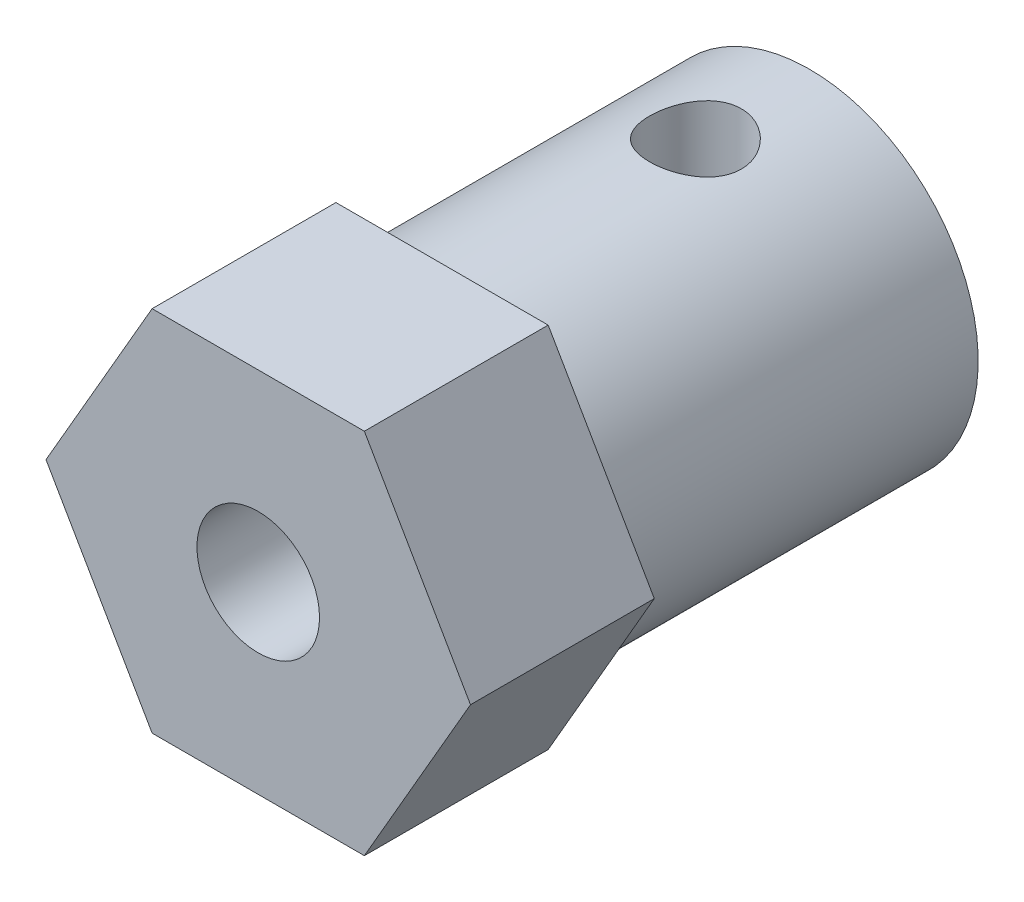
ISO-10303-21;
HEADER;
FILE_DESCRIPTION(('STEP AP214'),'2;1');
FILE_NAME('part.step','',(''),(''),'','','');
FILE_SCHEMA(('AUTOMOTIVE_DESIGN { 1 0 10303 214 1 1 1 1 }'));
ENDSEC;
DATA;
#1=APPLICATION_CONTEXT('core data for automotive mechanical design processes');
#2=APPLICATION_PROTOCOL_DEFINITION('international standard','automotive_design',2000,#1);
#3=PRODUCT_CONTEXT('',#1,'mechanical');
#4=PRODUCT('Part','Part','',(#3));
#5=PRODUCT_RELATED_PRODUCT_CATEGORY('part','',(#4));
#6=PRODUCT_DEFINITION_FORMATION('','',#4);
#7=PRODUCT_DEFINITION_CONTEXT('part definition',#1,'design');
#8=PRODUCT_DEFINITION('design','',#6,#7);
#9=PRODUCT_DEFINITION_SHAPE('','',#8);
#10=(LENGTH_UNIT() NAMED_UNIT(*) SI_UNIT(.MILLI.,.METRE.));
#11=(NAMED_UNIT(*) PLANE_ANGLE_UNIT() SI_UNIT($,.RADIAN.));
#12=(NAMED_UNIT(*) SI_UNIT($,.STERADIAN.) SOLID_ANGLE_UNIT());
#13=UNCERTAINTY_MEASURE_WITH_UNIT(LENGTH_MEASURE(1.E-05),#10,'distance_accuracy_value','');
#14=(GEOMETRIC_REPRESENTATION_CONTEXT(3) GLOBAL_UNCERTAINTY_ASSIGNED_CONTEXT((#13)) GLOBAL_UNIT_ASSIGNED_CONTEXT((#10,
#11,#12)) REPRESENTATION_CONTEXT('',''));
#15=CARTESIAN_POINT('',(0.,0.,0.));
#16=DIRECTION('',(0.,0.,1.));
#17=DIRECTION('',(1.,0.,0.));
#18=AXIS2_PLACEMENT_3D('',#15,#16,#17);
#19=CARTESIAN_POINT('',(0.,0.,0.));
#20=DIRECTION('',(0.,0.,-1.));
#21=DIRECTION('',(-1.,0.,0.));
#22=AXIS2_PLACEMENT_3D('',#19,#20,#21);
#23=PLANE('',#22);
#24=CARTESIAN_POINT('',(0.,0.,0.));
#25=DIRECTION('',(0.,0.,1.));
#26=DIRECTION('',(1.,0.,0.));
#27=AXIS2_PLACEMENT_3D('',#24,#25,#26);
#28=CIRCLE('',#27,2.);
#29=CARTESIAN_POINT('',(2.,0.,0.));
#30=VERTEX_POINT('',#29);
#31=EDGE_CURVE('E215',#30,#30,#28,.T.);
#32=ORIENTED_EDGE('',*,*,#31,.T.);
#33=EDGE_LOOP('',(#32));
#34=FACE_BOUND('',#33,.T.);
#35=CARTESIAN_POINT('',(0.,0.,0.));
#36=DIRECTION('',(0.,0.,-1.));
#37=DIRECTION('',(-1.,0.,0.));
#38=AXIS2_PLACEMENT_3D('',#35,#36,#37);
#39=CIRCLE('',#38,3.);
#40=CARTESIAN_POINT('',(-3.,0.,0.));
#41=VERTEX_POINT('',#40);
#42=EDGE_CURVE('E218',#41,#41,#39,.T.);
#43=ORIENTED_EDGE('',*,*,#42,.T.);
#44=EDGE_LOOP('',(#43));
#45=FACE_BOUND('',#44,.T.);
#46=ADVANCED_FACE('F34',(#34,#45),#23,.T.);
#47=CARTESIAN_POINT('',(0.,0.,6.));
#48=DIRECTION('',(0.,0.,-1.));
#49=DIRECTION('',(-1.,0.,0.));
#50=AXIS2_PLACEMENT_3D('',#47,#48,#49);
#51=PLANE('',#50);
#52=DIRECTION('',(-0.5,-0.866025403784439,0.));
#53=VECTOR('',#52,1.);
#54=CARTESIAN_POINT('',(-6.92820323027551,0.,6.));
#55=LINE('',#54,#53);
#56=CARTESIAN_POINT('',(-3.46410161513775,6.,6.));
#57=VERTEX_POINT('',#56);
#58=CARTESIAN_POINT('',(-6.92820323027551,0.,6.));
#59=VERTEX_POINT('',#58);
#60=EDGE_CURVE('E139',#57,#59,#55,.T.);
#61=ORIENTED_EDGE('',*,*,#60,.T.);
#62=DIRECTION('',(0.5,-0.866025403784439,0.));
#63=VECTOR('',#62,1.);
#64=CARTESIAN_POINT('',(-3.46410161513775,-6.,6.));
#65=LINE('',#64,#63);
#66=CARTESIAN_POINT('',(-3.46410161513775,-6.,6.));
#67=VERTEX_POINT('',#66);
#68=EDGE_CURVE('E96',#59,#67,#65,.T.);
#69=ORIENTED_EDGE('',*,*,#68,.T.);
#70=DIRECTION('',(1.,0.,0.));
#71=VECTOR('',#70,1.);
#72=CARTESIAN_POINT('',(3.46410161513775,-6.,6.));
#73=LINE('',#72,#71);
#74=CARTESIAN_POINT('',(3.46410161513775,-6.,6.));
#75=VERTEX_POINT('',#74);
#76=EDGE_CURVE('E110',#67,#75,#73,.T.);
#77=ORIENTED_EDGE('',*,*,#76,.T.);
#78=DIRECTION('',(0.5,0.866025403784439,0.));
#79=VECTOR('',#78,1.);
#80=CARTESIAN_POINT('',(6.92820323027551,0.,6.));
#81=LINE('',#80,#79);
#82=CARTESIAN_POINT('',(6.92820323027551,0.,6.));
#83=VERTEX_POINT('',#82);
#84=EDGE_CURVE('E103',#75,#83,#81,.T.);
#85=ORIENTED_EDGE('',*,*,#84,.T.);
#86=DIRECTION('',(-0.5,0.866025403784439,0.));
#87=VECTOR('',#86,1.);
#88=CARTESIAN_POINT('',(3.46410161513775,6.,6.));
#89=LINE('',#88,#87);
#90=CARTESIAN_POINT('',(3.46410161513775,6.,6.));
#91=VERTEX_POINT('',#90);
#92=EDGE_CURVE('E108',#83,#91,#89,.T.);
#93=ORIENTED_EDGE('',*,*,#92,.T.);
#94=DIRECTION('',(-1.,0.,0.));
#95=VECTOR('',#94,1.);
#96=CARTESIAN_POINT('',(-3.46410161513775,6.,6.));
#97=LINE('',#96,#95);
#98=EDGE_CURVE('E58',#91,#57,#97,.T.);
#99=ORIENTED_EDGE('',*,*,#98,.T.);
#100=EDGE_LOOP('',(#61,#69,#77,#85,#93,#99));
#101=FACE_BOUND('',#100,.T.);
#102=CARTESIAN_POINT('',(0.,0.,6.));
#103=DIRECTION('',(0.,0.,1.));
#104=DIRECTION('',(1.,0.,0.));
#105=AXIS2_PLACEMENT_3D('',#102,#103,#104);
#106=CIRCLE('',#105,2.);
#107=CARTESIAN_POINT('',(2.,0.,6.));
#108=VERTEX_POINT('',#107);
#109=EDGE_CURVE('E132',#108,#108,#106,.T.);
#110=ORIENTED_EDGE('',*,*,#109,.F.);
#111=EDGE_LOOP('',(#110));
#112=FACE_BOUND('',#111,.T.);
#113=ADVANCED_FACE('F105',(#101,#112),#51,.F.);
#114=CARTESIAN_POINT('',(0.,0.,0.));
#115=DIRECTION('',(0.,0.,-1.));
#116=DIRECTION('',(-1.,0.,0.));
#117=AXIS2_PLACEMENT_3D('',#114,#115,#116);
#118=CIRCLE('',#117,5.5);
#119=CARTESIAN_POINT('',(-5.5,0.,0.));
#120=VERTEX_POINT('',#119);
#121=EDGE_CURVE('E11',#120,#120,#118,.T.);
#122=ORIENTED_EDGE('',*,*,#121,.F.);
#123=EDGE_LOOP('',(#122));
#124=FACE_BOUND('',#123,.T.);
#125=DIRECTION('',(-0.5,-0.866025403784439,0.));
#126=VECTOR('',#125,1.);
#127=CARTESIAN_POINT('',(-6.92820323027551,0.,0.));
#128=LINE('',#127,#126);
#129=CARTESIAN_POINT('',(-3.46410161513775,6.,0.));
#130=VERTEX_POINT('',#129);
#131=CARTESIAN_POINT('',(-6.92820323027551,0.,0.));
#132=VERTEX_POINT('',#131);
#133=EDGE_CURVE('E128',#130,#132,#128,.T.);
#134=ORIENTED_EDGE('',*,*,#133,.F.);
#135=DIRECTION('',(-1.,0.,0.));
#136=VECTOR('',#135,1.);
#137=CARTESIAN_POINT('',(-3.46410161513775,6.,0.));
#138=LINE('',#137,#136);
#139=CARTESIAN_POINT('',(3.46410161513775,6.,0.));
#140=VERTEX_POINT('',#139);
#141=EDGE_CURVE('E87',#140,#130,#138,.T.);
#142=ORIENTED_EDGE('',*,*,#141,.F.);
#143=DIRECTION('',(-0.5,0.866025403784439,0.));
#144=VECTOR('',#143,1.);
#145=CARTESIAN_POINT('',(3.46410161513775,6.,0.));
#146=LINE('',#145,#144);
#147=CARTESIAN_POINT('',(6.92820323027551,0.,0.));
#148=VERTEX_POINT('',#147);
#149=EDGE_CURVE('E81',#148,#140,#146,.T.);
#150=ORIENTED_EDGE('',*,*,#149,.F.);
#151=DIRECTION('',(0.5,0.866025403784439,0.));
#152=VECTOR('',#151,1.);
#153=CARTESIAN_POINT('',(6.92820323027551,0.,0.));
#154=LINE('',#153,#152);
#155=CARTESIAN_POINT('',(3.46410161513775,-6.,0.));
#156=VERTEX_POINT('',#155);
#157=EDGE_CURVE('E118',#156,#148,#154,.T.);
#158=ORIENTED_EDGE('',*,*,#157,.F.);
#159=DIRECTION('',(1.,0.,0.));
#160=VECTOR('',#159,1.);
#161=CARTESIAN_POINT('',(3.46410161513775,-6.,0.));
#162=LINE('',#161,#160);
#163=CARTESIAN_POINT('',(-3.46410161513775,-6.,0.));
#164=VERTEX_POINT('',#163);
#165=EDGE_CURVE('E134',#164,#156,#162,.T.);
#166=ORIENTED_EDGE('',*,*,#165,.F.);
#167=DIRECTION('',(0.5,-0.866025403784439,0.));
#168=VECTOR('',#167,1.);
#169=CARTESIAN_POINT('',(-3.46410161513775,-6.,0.));
#170=LINE('',#169,#168);
#171=EDGE_CURVE('E131',#132,#164,#170,.T.);
#172=ORIENTED_EDGE('',*,*,#171,.F.);
#173=EDGE_LOOP('',(#134,#142,#150,#158,#166,#172));
#174=FACE_BOUND('',#173,.T.);
#175=ADVANCED_FACE('F189',(#124,#174),#23,.T.);
#176=CARTESIAN_POINT('',(-6.92820323027551,0.,6.));
#177=DIRECTION('',(0.866025403784439,-0.5,0.));
#178=DIRECTION('',(0.5,0.866025403784439,0.));
#179=AXIS2_PLACEMENT_3D('',#176,#177,#178);
#180=PLANE('',#179);
#181=ORIENTED_EDGE('',*,*,#133,.T.);
#182=DIRECTION('',(0.,0.,-1.));
#183=VECTOR('',#182,1.);
#184=CARTESIAN_POINT('',(-6.92820323027551,0.,6.));
#185=LINE('',#184,#183);
#186=EDGE_CURVE('E49',#59,#132,#185,.T.);
#187=ORIENTED_EDGE('',*,*,#186,.F.);
#188=ORIENTED_EDGE('',*,*,#60,.F.);
#189=DIRECTION('',(0.,0.,-1.));
#190=VECTOR('',#189,1.);
#191=CARTESIAN_POINT('',(-3.46410161513775,6.,6.));
#192=LINE('',#191,#190);
#193=EDGE_CURVE('E124',#57,#130,#192,.T.);
#194=ORIENTED_EDGE('',*,*,#193,.T.);
#195=EDGE_LOOP('',(#181,#187,#188,#194));
#196=FACE_BOUND('',#195,.T.);
#197=ADVANCED_FACE('F36',(#196),#180,.F.);
#198=CARTESIAN_POINT('',(-3.46410161513775,-6.,6.));
#199=DIRECTION('',(0.866025403784439,0.5,0.));
#200=DIRECTION('',(-0.5,0.866025403784439,0.));
#201=AXIS2_PLACEMENT_3D('',#198,#199,#200);
#202=PLANE('',#201);
#203=ORIENTED_EDGE('',*,*,#171,.T.);
#204=DIRECTION('',(0.,0.,-1.));
#205=VECTOR('',#204,1.);
#206=CARTESIAN_POINT('',(-3.46410161513775,-6.,6.));
#207=LINE('',#206,#205);
#208=EDGE_CURVE('E143',#67,#164,#207,.T.);
#209=ORIENTED_EDGE('',*,*,#208,.F.);
#210=ORIENTED_EDGE('',*,*,#68,.F.);
#211=ORIENTED_EDGE('',*,*,#186,.T.);
#212=EDGE_LOOP('',(#203,#209,#210,#211));
#213=FACE_BOUND('',#212,.T.);
#214=ADVANCED_FACE('F201',(#213),#202,.F.);
#215=CARTESIAN_POINT('',(3.46410161513775,-6.,6.));
#216=DIRECTION('',(0.,1.,0.));
#217=DIRECTION('',(-1.,0.,0.));
#218=AXIS2_PLACEMENT_3D('',#215,#216,#217);
#219=PLANE('',#218);
#220=ORIENTED_EDGE('',*,*,#165,.T.);
#221=DIRECTION('',(0.,0.,-1.));
#222=VECTOR('',#221,1.);
#223=CARTESIAN_POINT('',(3.46410161513775,-6.,6.));
#224=LINE('',#223,#222);
#225=EDGE_CURVE('E119',#75,#156,#224,.T.);
#226=ORIENTED_EDGE('',*,*,#225,.F.);
#227=ORIENTED_EDGE('',*,*,#76,.F.);
#228=ORIENTED_EDGE('',*,*,#208,.T.);
#229=EDGE_LOOP('',(#220,#226,#227,#228));
#230=FACE_BOUND('',#229,.T.);
#231=ADVANCED_FACE('F199',(#230),#219,.F.);
#232=CARTESIAN_POINT('',(6.92820323027551,0.,6.));
#233=DIRECTION('',(-0.866025403784438,0.5,0.));
#234=DIRECTION('',(-0.5,-0.866025403784439,0.));
#235=AXIS2_PLACEMENT_3D('',#232,#233,#234);
#236=PLANE('',#235);
#237=ORIENTED_EDGE('',*,*,#157,.T.);
#238=DIRECTION('',(0.,0.,-1.));
#239=VECTOR('',#238,1.);
#240=CARTESIAN_POINT('',(6.92820323027551,0.,6.));
#241=LINE('',#240,#239);
#242=EDGE_CURVE('E115',#83,#148,#241,.T.);
#243=ORIENTED_EDGE('',*,*,#242,.F.);
#244=ORIENTED_EDGE('',*,*,#84,.F.);
#245=ORIENTED_EDGE('',*,*,#225,.T.);
#246=EDGE_LOOP('',(#237,#243,#244,#245));
#247=FACE_BOUND('',#246,.T.);
#248=ADVANCED_FACE('F116',(#247),#236,.F.);
#249=CARTESIAN_POINT('',(3.46410161513775,6.,6.));
#250=DIRECTION('',(-0.866025403784439,-0.5,0.));
#251=DIRECTION('',(0.5,-0.866025403784439,0.));
#252=AXIS2_PLACEMENT_3D('',#249,#250,#251);
#253=PLANE('',#252);
#254=ORIENTED_EDGE('',*,*,#149,.T.);
#255=DIRECTION('',(0.,0.,-1.));
#256=VECTOR('',#255,1.);
#257=CARTESIAN_POINT('',(3.46410161513775,6.,6.));
#258=LINE('',#257,#256);
#259=EDGE_CURVE('E120',#91,#140,#258,.T.);
#260=ORIENTED_EDGE('',*,*,#259,.F.);
#261=ORIENTED_EDGE('',*,*,#92,.F.);
#262=ORIENTED_EDGE('',*,*,#242,.T.);
#263=EDGE_LOOP('',(#254,#260,#261,#262));
#264=FACE_BOUND('',#263,.T.);
#265=ADVANCED_FACE('F122',(#264),#253,.F.);
#266=CARTESIAN_POINT('',(-3.46410161513775,6.,6.));
#267=DIRECTION('',(0.,-1.,0.));
#268=DIRECTION('',(0.,0.,-1.));
#269=AXIS2_PLACEMENT_3D('',#266,#267,#268);
#270=PLANE('',#269);
#271=ORIENTED_EDGE('',*,*,#141,.T.);
#272=ORIENTED_EDGE('',*,*,#193,.F.);
#273=ORIENTED_EDGE('',*,*,#98,.F.);
#274=ORIENTED_EDGE('',*,*,#259,.T.);
#275=EDGE_LOOP('',(#271,#272,#273,#274));
#276=FACE_BOUND('',#275,.T.);
#277=ADVANCED_FACE('F185',(#276),#270,.F.);
#278=CARTESIAN_POINT('',(0.,0.,6.));
#279=DIRECTION('',(0.,0.,-1.));
#280=DIRECTION('',(-1.,0.,0.));
#281=AXIS2_PLACEMENT_3D('',#278,#279,#280);
#282=CYLINDRICAL_SURFACE('',#281,2.);
#283=ORIENTED_EDGE('',*,*,#109,.T.);
#284=EDGE_LOOP('',(#283));
#285=FACE_BOUND('',#284,.T.);
#286=ORIENTED_EDGE('',*,*,#31,.F.);
#287=EDGE_LOOP('',(#286));
#288=FACE_BOUND('',#287,.T.);
#289=ADVANCED_FACE('F181',(#285,#288),#282,.F.);
#290=CARTESIAN_POINT('',(0.,0.,-12.));
#291=DIRECTION('',(0.,0.,-1.));
#292=DIRECTION('',(-1.,0.,0.));
#293=AXIS2_PLACEMENT_3D('',#290,#291,#292);
#294=PLANE('',#293);
#295=CARTESIAN_POINT('',(0.,0.,-12.));
#296=DIRECTION('',(0.,0.,-1.));
#297=DIRECTION('',(-1.,0.,0.));
#298=AXIS2_PLACEMENT_3D('',#295,#296,#297);
#299=CIRCLE('',#298,5.5);
#300=CARTESIAN_POINT('',(-5.5,0.,-12.));
#301=VERTEX_POINT('',#300);
#302=EDGE_CURVE('E223',#301,#301,#299,.T.);
#303=ORIENTED_EDGE('',*,*,#302,.T.);
#304=EDGE_LOOP('',(#303));
#305=FACE_BOUND('',#304,.T.);
#306=CARTESIAN_POINT('',(0.,0.,-12.));
#307=DIRECTION('',(0.,0.,-1.));
#308=DIRECTION('',(-1.,0.,0.));
#309=AXIS2_PLACEMENT_3D('',#306,#307,#308);
#310=CIRCLE('',#309,3.);
#311=CARTESIAN_POINT('',(-3.,0.,-12.));
#312=VERTEX_POINT('',#311);
#313=EDGE_CURVE('E220',#312,#312,#310,.T.);
#314=ORIENTED_EDGE('',*,*,#313,.F.);
#315=EDGE_LOOP('',(#314));
#316=FACE_BOUND('',#315,.T.);
#317=ADVANCED_FACE('F179',(#305,#316),#294,.T.);
#318=CARTESIAN_POINT('',(0.,0.,-12.));
#319=DIRECTION('',(0.,0.,1.));
#320=DIRECTION('',(1.,0.,0.));
#321=AXIS2_PLACEMENT_3D('',#318,#319,#320);
#322=CYLINDRICAL_SURFACE('',#321,5.5);
#323=CARTESIAN_POINT('',(0.,-5.5,-6.76992574468385));
#324=CARTESIAN_POINT('',(0.0826209133321935,-5.49999882717412,-6.76992755729488));
#325=CARTESIAN_POINT('',(0.165260978812708,-5.49812007260761,-6.77677480826727));
#326=CARTESIAN_POINT('',(0.328155930157698,-5.49080798085451,-6.80393157498703));
#327=CARTESIAN_POINT('',(0.408409727977265,-5.48537304740499,-6.82424713631245));
#328=CARTESIAN_POINT('',(0.564157626055395,-5.47154772174135,-6.87762747642228));
#329=CARTESIAN_POINT('',(0.639657866970163,-5.46316123869395,-6.91067539734577));
#330=CARTESIAN_POINT('',(0.78404449615972,-5.44431654412848,-6.98851867734628));
#331=CARTESIAN_POINT('',(0.852930363289777,-5.43385816956517,-7.03331496103778));
#332=CARTESIAN_POINT('',(0.983796947573261,-5.41171397042059,-7.13452558115111));
#333=CARTESIAN_POINT('',(1.04559512916994,-5.40000641490429,-7.19117118553806));
#334=CARTESIAN_POINT('',(1.15894293682478,-5.37682112935063,-7.31397838071376));
#335=CARTESIAN_POINT('',(1.21049117824721,-5.36534343055203,-7.38014125508617));
#336=CARTESIAN_POINT('',(1.30277794539497,-5.34369384163659,-7.52157699226333));
#337=CARTESIAN_POINT('',(1.34330426837586,-5.33354930058623,-7.59699288962013));
#338=CARTESIAN_POINT('',(1.41102916361227,-5.31603507411917,-7.75388957288323));
#339=CARTESIAN_POINT('',(1.43823031946844,-5.30866485085754,-7.83536917957234));
#340=CARTESIAN_POINT('',(1.47789456441268,-5.2977584719274,-8.00005363969632));
#341=CARTESIAN_POINT('',(1.49068960543229,-5.29413612283787,-8.08317269284577));
#342=CARTESIAN_POINT('',(1.50221364409134,-5.29087829084083,-8.25045042769266));
#343=CARTESIAN_POINT('',(1.50094540140882,-5.2912420257326,-8.33460890218388));
#344=CARTESIAN_POINT('',(1.48464191780301,-5.29583824875456,-8.49896729565012));
#345=CARTESIAN_POINT('',(1.47001073668932,-5.29995718313671,-8.57921097928609));
#346=CARTESIAN_POINT('',(1.42804483871807,-5.3114175579406,-8.73605903070666));
#347=CARTESIAN_POINT('',(1.40070906504647,-5.31875926644153,-8.81266309515015));
#348=CARTESIAN_POINT('',(1.3337862982647,-5.33593618292326,-8.96109926523131));
#349=CARTESIAN_POINT('',(1.29405951882948,-5.34579959764141,-9.03286494571747));
#350=CARTESIAN_POINT('',(1.20357988022174,-5.36689368797792,-9.16885219209351));
#351=CARTESIAN_POINT('',(1.15282476106209,-5.37812464363249,-9.23307220752259));
#352=CARTESIAN_POINT('',(1.03967346682896,-5.40115894990605,-9.35445093449029));
#353=CARTESIAN_POINT('',(0.976938646167251,-5.41296874297114,-9.41129319397279));
#354=CARTESIAN_POINT('',(0.842682011788636,-5.43548647707978,-9.51371670966164));
#355=CARTESIAN_POINT('',(0.771159819718553,-5.44619437064292,-9.55929748073348));
#356=CARTESIAN_POINT('',(0.620853953739623,-5.46537278121261,-9.63805241745878));
#357=CARTESIAN_POINT('',(0.542037637417773,-5.47383251287305,-9.6711670832678));
#358=CARTESIAN_POINT('',(0.37967268871439,-5.48748356142612,-9.723583717198));
#359=CARTESIAN_POINT('',(0.296125144317682,-5.49267562644564,-9.742888847128));
#360=CARTESIAN_POINT('',(0.129368170483251,-5.49909228776313,-9.76663636248083));
#361=CARTESIAN_POINT('',(0.0462242977839802,-5.50043163125371,-9.77150874000422));
#362=CARTESIAN_POINT('',(-0.119693365637972,-5.49932301585136,-9.76744299717042));
#363=CARTESIAN_POINT('',(-0.202467195532507,-5.49687546782998,-9.75850637506736));
#364=CARTESIAN_POINT('',(-0.363745097739556,-5.48854239265957,-9.72742824198071));
#365=CARTESIAN_POINT('',(-0.442299324272677,-5.48271986472129,-9.70552855192685));
#366=CARTESIAN_POINT('',(-0.594609867448631,-5.46829923535645,-9.64942850004336));
#367=CARTESIAN_POINT('',(-0.668365651304996,-5.45970082634473,-9.61522677502257));
#368=CARTESIAN_POINT('',(-0.810641161194591,-5.44041573828275,-9.53470930239817));
#369=CARTESIAN_POINT('',(-0.879024602412584,-5.4296902954988,-9.4881622574223));
#370=CARTESIAN_POINT('',(-1.00716022013082,-5.40738988410034,-9.38456445713861));
#371=CARTESIAN_POINT('',(-1.06691060617763,-5.39581474001048,-9.32751152852634));
#372=CARTESIAN_POINT('',(-1.17791060344313,-5.37269401558495,-9.20251170664897));
#373=CARTESIAN_POINT('',(-1.22885627747222,-5.36115944983886,-9.1342923624049));
#374=CARTESIAN_POINT('',(-1.3185858220796,-5.33980026187814,-8.9900270974646));
#375=CARTESIAN_POINT('',(-1.35737017925923,-5.32997557125461,-8.91398149007633));
#376=CARTESIAN_POINT('',(-1.42138558317209,-5.31326248703816,-8.75658511644189));
#377=CARTESIAN_POINT('',(-1.44669352306985,-5.30635748202252,-8.67526748415863));
#378=CARTESIAN_POINT('',(-1.48320917220692,-5.29626814696188,-8.5093089066563));
#379=CARTESIAN_POINT('',(-1.49442068863148,-5.29308281231875,-8.42466886513019));
#380=CARTESIAN_POINT('',(-1.50219895576908,-5.29088009671763,-8.2575873408664));
#381=CARTESIAN_POINT('',(-1.49925533217026,-5.29172336001588,-8.17517015596136));
#382=CARTESIAN_POINT('',(-1.47994837643976,-5.29715501736986,-8.01205509694888));
#383=CARTESIAN_POINT('',(-1.46358542028567,-5.30174330649891,-7.93135717473681));
#384=CARTESIAN_POINT('',(-1.41819408435119,-5.31406316491799,-7.77461942890773));
#385=CARTESIAN_POINT('',(-1.38927395449127,-5.32176783125817,-7.69854599144209));
#386=CARTESIAN_POINT('',(-1.31967304541385,-5.33945189987964,-7.55227246787052));
#387=CARTESIAN_POINT('',(-1.27899034504456,-5.34943167369227,-7.48207334361868));
#388=CARTESIAN_POINT('',(-1.18555430984851,-5.37092379381814,-7.34721514699121));
#389=CARTESIAN_POINT('',(-1.13246901822125,-5.38247375845259,-7.28279203984074));
#390=CARTESIAN_POINT('',(-1.01636011199274,-5.40559990490855,-7.16360933788925));
#391=CARTESIAN_POINT('',(-0.953334059387993,-5.41717609247304,-7.10885212067852));
#392=CARTESIAN_POINT('',(-0.817407725686078,-5.43936459177359,-7.00933113016445));
#393=CARTESIAN_POINT('',(-0.744315866262519,-5.44994907753807,-6.96482226381688));
#394=CARTESIAN_POINT('',(-0.591399899839279,-5.46865263780403,-6.88879330847238));
#395=CARTESIAN_POINT('',(-0.51157995242122,-5.47677322151197,-6.85726526412953));
#396=CARTESIAN_POINT('',(-0.36010010121821,-5.48864193995757,-6.81198623470486));
#397=CARTESIAN_POINT('',(-0.289064640262467,-5.49286947681091,-6.79625119344215));
#398=CARTESIAN_POINT('',(-0.145357607941484,-5.49854887164354,-6.77522071936503));
#399=CARTESIAN_POINT('',(-0.0726862155649467,-5.5000010318002,-6.76992415002906));
#400=CARTESIAN_POINT('',(0.,-5.5,-6.76992574468385));
#401=B_SPLINE_CURVE_WITH_KNOTS('',3,(#323,#324,#325,#326,#327,#328,#329,#330,#331,#332,#333,
#334,#335,#336,#337,#338,#339,#340,#341,#342,#343,#344,#345,#346,#347,#348,#349,#350,#351,#352,
#353,#354,#355,#356,#357,#358,#359,#360,#361,#362,#363,#364,#365,#366,#367,#368,#369,#370,#371,
#372,#373,#374,#375,#376,#377,#378,#379,#380,#381,#382,#383,#384,#385,#386,#387,#388,#389,#390,
#391,#392,#393,#394,#395,#396,#397,#398,#399,#400),.UNSPECIFIED.,.T.,.F.,(4,2,2,2,2,2,2,2,2,2,2,
2,2,2,2,2,2,2,2,2,2,2,2,2,2,2,2,2,2,2,2,2,2,2,2,2,2,2,4),(0.,0.247596106854897,0.4953034285513,
0.742683902420579,0.990083851364706,1.24285878223179,1.49566783659324,1.75304593650219,
2.01037411390996,2.26164304860926,2.51286267696538,2.75672886674887,3.00061534583717,
3.24735926767928,3.49415380139121,3.74938528550775,4.00462776284424,4.26107349736029,
4.51746049766944,4.76612811343083,5.01476875105251,5.25891111200195,5.50308053475836,
5.75219469009681,6.00136043656003,6.2579007306487,6.51443075867912,6.76948096455404,
7.02446227124211,7.27068852228629,7.51690787489588,7.76104555655817,8.00522313517586,
8.25689011392092,8.50861891104974,8.76605872289059,9.02334052607437,9.2411883209319,
9.45901239561305),.UNSPECIFIED.);
#402=CARTESIAN_POINT('',(0.,-5.5,-6.76992574468385));
#403=VERTEX_POINT('',#402);
#404=EDGE_CURVE('E170',#403,#403,#401,.T.);
#405=ORIENTED_EDGE('',*,*,#404,.T.);
#406=EDGE_LOOP('',(#405));
#407=FACE_BOUND('',#406,.T.);
#408=CARTESIAN_POINT('',(0.,5.5,-6.76992574468385));
#409=CARTESIAN_POINT('',(-0.0826209133321935,5.49999882717412,-6.76992755729488));
#410=CARTESIAN_POINT('',(-0.165260978812708,5.49812007260761,-6.77677480826727));
#411=CARTESIAN_POINT('',(-0.328155930157698,5.49080798085451,-6.80393157498703));
#412=CARTESIAN_POINT('',(-0.408409727977265,5.48537304740499,-6.82424713631245));
#413=CARTESIAN_POINT('',(-0.564157626055395,5.47154772174135,-6.87762747642228));
#414=CARTESIAN_POINT('',(-0.639657866970163,5.46316123869395,-6.91067539734577));
#415=CARTESIAN_POINT('',(-0.78404449615972,5.44431654412848,-6.98851867734628));
#416=CARTESIAN_POINT('',(-0.852930363289777,5.43385816956517,-7.03331496103778));
#417=CARTESIAN_POINT('',(-0.983796947573261,5.41171397042059,-7.13452558115111));
#418=CARTESIAN_POINT('',(-1.04559512916994,5.40000641490429,-7.19117118553806));
#419=CARTESIAN_POINT('',(-1.15894293682478,5.37682112935063,-7.31397838071376));
#420=CARTESIAN_POINT('',(-1.21049117824721,5.36534343055203,-7.38014125508617));
#421=CARTESIAN_POINT('',(-1.30277794539497,5.34369384163659,-7.52157699226333));
#422=CARTESIAN_POINT('',(-1.34330426837586,5.33354930058623,-7.59699288962013));
#423=CARTESIAN_POINT('',(-1.41102916361227,5.31603507411917,-7.75388957288323));
#424=CARTESIAN_POINT('',(-1.43823031946844,5.30866485085754,-7.83536917957234));
#425=CARTESIAN_POINT('',(-1.47789456441268,5.2977584719274,-8.00005363969632));
#426=CARTESIAN_POINT('',(-1.49068960543229,5.29413612283787,-8.08317269284577));
#427=CARTESIAN_POINT('',(-1.50221364409134,5.29087829084083,-8.25045042769266));
#428=CARTESIAN_POINT('',(-1.50094540140882,5.2912420257326,-8.33460890218388));
#429=CARTESIAN_POINT('',(-1.48464191780301,5.29583824875456,-8.49896729565012));
#430=CARTESIAN_POINT('',(-1.47001073668932,5.29995718313671,-8.57921097928609));
#431=CARTESIAN_POINT('',(-1.42804483871807,5.3114175579406,-8.73605903070666));
#432=CARTESIAN_POINT('',(-1.40070906504647,5.31875926644153,-8.81266309515015));
#433=CARTESIAN_POINT('',(-1.3337862982647,5.33593618292326,-8.96109926523131));
#434=CARTESIAN_POINT('',(-1.29405951882948,5.34579959764141,-9.03286494571747));
#435=CARTESIAN_POINT('',(-1.20357988022174,5.36689368797792,-9.16885219209351));
#436=CARTESIAN_POINT('',(-1.15282476106209,5.37812464363249,-9.23307220752259));
#437=CARTESIAN_POINT('',(-1.03967346682896,5.40115894990605,-9.35445093449029));
#438=CARTESIAN_POINT('',(-0.976938646167251,5.41296874297114,-9.41129319397279));
#439=CARTESIAN_POINT('',(-0.842682011788636,5.43548647707978,-9.51371670966164));
#440=CARTESIAN_POINT('',(-0.771159819718553,5.44619437064292,-9.55929748073348));
#441=CARTESIAN_POINT('',(-0.620853953739623,5.46537278121261,-9.63805241745878));
#442=CARTESIAN_POINT('',(-0.542037637417773,5.47383251287305,-9.6711670832678));
#443=CARTESIAN_POINT('',(-0.37967268871439,5.48748356142612,-9.723583717198));
#444=CARTESIAN_POINT('',(-0.296125144317682,5.49267562644564,-9.742888847128));
#445=CARTESIAN_POINT('',(-0.129368170483251,5.49909228776313,-9.76663636248083));
#446=CARTESIAN_POINT('',(-0.0462242977839802,5.50043163125371,-9.77150874000422));
#447=CARTESIAN_POINT('',(0.119693365637972,5.49932301585136,-9.76744299717042));
#448=CARTESIAN_POINT('',(0.202467195532507,5.49687546782998,-9.75850637506736));
#449=CARTESIAN_POINT('',(0.363745097739556,5.48854239265957,-9.72742824198071));
#450=CARTESIAN_POINT('',(0.442299324272677,5.48271986472129,-9.70552855192685));
#451=CARTESIAN_POINT('',(0.594609867448631,5.46829923535645,-9.64942850004336));
#452=CARTESIAN_POINT('',(0.668365651304996,5.45970082634473,-9.61522677502257));
#453=CARTESIAN_POINT('',(0.810641161194591,5.44041573828275,-9.53470930239817));
#454=CARTESIAN_POINT('',(0.879024602412584,5.4296902954988,-9.4881622574223));
#455=CARTESIAN_POINT('',(1.00716022013082,5.40738988410034,-9.38456445713861));
#456=CARTESIAN_POINT('',(1.06691060617763,5.39581474001048,-9.32751152852634));
#457=CARTESIAN_POINT('',(1.17791060344313,5.37269401558495,-9.20251170664897));
#458=CARTESIAN_POINT('',(1.22885627747222,5.36115944983886,-9.1342923624049));
#459=CARTESIAN_POINT('',(1.3185858220796,5.33980026187814,-8.9900270974646));
#460=CARTESIAN_POINT('',(1.35737017925923,5.32997557125461,-8.91398149007633));
#461=CARTESIAN_POINT('',(1.42138558317209,5.31326248703816,-8.75658511644189));
#462=CARTESIAN_POINT('',(1.44669352306985,5.30635748202252,-8.67526748415863));
#463=CARTESIAN_POINT('',(1.48320917220692,5.29626814696188,-8.5093089066563));
#464=CARTESIAN_POINT('',(1.49442068863148,5.29308281231875,-8.42466886513019));
#465=CARTESIAN_POINT('',(1.50219895576908,5.29088009671763,-8.2575873408664));
#466=CARTESIAN_POINT('',(1.49925533217026,5.29172336001588,-8.17517015596136));
#467=CARTESIAN_POINT('',(1.47994837643976,5.29715501736986,-8.01205509694888));
#468=CARTESIAN_POINT('',(1.46358542028567,5.30174330649891,-7.93135717473681));
#469=CARTESIAN_POINT('',(1.41819408435119,5.31406316491799,-7.77461942890773));
#470=CARTESIAN_POINT('',(1.38927395449127,5.32176783125817,-7.69854599144209));
#471=CARTESIAN_POINT('',(1.31967304541385,5.33945189987964,-7.55227246787052));
#472=CARTESIAN_POINT('',(1.27899034504456,5.34943167369227,-7.48207334361868));
#473=CARTESIAN_POINT('',(1.18555430984851,5.37092379381814,-7.34721514699121));
#474=CARTESIAN_POINT('',(1.13246901822125,5.38247375845259,-7.28279203984074));
#475=CARTESIAN_POINT('',(1.01636011199274,5.40559990490855,-7.16360933788925));
#476=CARTESIAN_POINT('',(0.953334059387993,5.41717609247304,-7.10885212067852));
#477=CARTESIAN_POINT('',(0.817407725686078,5.43936459177359,-7.00933113016445));
#478=CARTESIAN_POINT('',(0.744315866262519,5.44994907753807,-6.96482226381688));
#479=CARTESIAN_POINT('',(0.591399899839279,5.46865263780403,-6.88879330847238));
#480=CARTESIAN_POINT('',(0.51157995242122,5.47677322151197,-6.85726526412953));
#481=CARTESIAN_POINT('',(0.36010010121821,5.48864193995757,-6.81198623470486));
#482=CARTESIAN_POINT('',(0.289064640262467,5.49286947681091,-6.79625119344215));
#483=CARTESIAN_POINT('',(0.145357607941484,5.49854887164354,-6.77522071936503));
#484=CARTESIAN_POINT('',(0.0726862155649467,5.5000010318002,-6.76992415002906));
#485=CARTESIAN_POINT('',(0.,5.5,-6.76992574468385));
#486=B_SPLINE_CURVE_WITH_KNOTS('',3,(#408,#409,#410,#411,#412,#413,#414,#415,#416,#417,#418,
#419,#420,#421,#422,#423,#424,#425,#426,#427,#428,#429,#430,#431,#432,#433,#434,#435,#436,#437,
#438,#439,#440,#441,#442,#443,#444,#445,#446,#447,#448,#449,#450,#451,#452,#453,#454,#455,#456,
#457,#458,#459,#460,#461,#462,#463,#464,#465,#466,#467,#468,#469,#470,#471,#472,#473,#474,#475,
#476,#477,#478,#479,#480,#481,#482,#483,#484,#485),.UNSPECIFIED.,.T.,.F.,(4,2,2,2,2,2,2,2,2,2,2,
2,2,2,2,2,2,2,2,2,2,2,2,2,2,2,2,2,2,2,2,2,2,2,2,2,2,2,4),(0.,0.247596106854897,0.4953034285513,
0.742683902420579,0.990083851364706,1.24285878223179,1.49566783659324,1.75304593650219,
2.01037411390996,2.26164304860926,2.51286267696538,2.75672886674887,3.00061534583717,
3.24735926767928,3.49415380139121,3.74938528550775,4.00462776284424,4.26107349736029,
4.51746049766944,4.76612811343083,5.01476875105251,5.25891111200195,5.50308053475836,
5.75219469009681,6.00136043656003,6.2579007306487,6.51443075867912,6.76948096455404,
7.02446227124211,7.27068852228629,7.51690787489588,7.76104555655817,8.00522313517586,
8.25689011392092,8.50861891104974,8.76605872289059,9.02334052607437,9.2411883209319,
9.45901239561305),.UNSPECIFIED.);
#487=CARTESIAN_POINT('',(0.,5.5,-6.76992574468385));
#488=VERTEX_POINT('',#487);
#489=EDGE_CURVE('E164',#488,#488,#486,.T.);
#490=ORIENTED_EDGE('',*,*,#489,.T.);
#491=EDGE_LOOP('',(#490));
#492=FACE_BOUND('',#491,.T.);
#493=ORIENTED_EDGE('',*,*,#302,.F.);
#494=EDGE_LOOP('',(#493));
#495=FACE_BOUND('',#494,.T.);
#496=ORIENTED_EDGE('',*,*,#121,.T.);
#497=EDGE_LOOP('',(#496));
#498=FACE_BOUND('',#497,.T.);
#499=ADVANCED_FACE('F175',(#407,#492,#495,#498),#322,.T.);
#500=CARTESIAN_POINT('',(0.,0.,-12.));
#501=DIRECTION('',(0.,0.,1.));
#502=DIRECTION('',(1.,0.,0.));
#503=AXIS2_PLACEMENT_3D('',#500,#501,#502);
#504=CYLINDRICAL_SURFACE('',#503,3.);
#505=CARTESIAN_POINT('',(0.,-3.,-6.76992574468385));
#506=CARTESIAN_POINT('',(0.0788579444268502,-2.99999570107562,-6.76993069815964));
#507=CARTESIAN_POINT('',(0.157809899546344,-2.99685736529635,-6.77618085436544));
#508=CARTESIAN_POINT('',(0.313380352903344,-2.98461234055736,-6.80090506519616));
#509=CARTESIAN_POINT('',(0.389994130070444,-2.97549431743379,-6.81940233418058));
#510=CARTESIAN_POINT('',(0.538400317320673,-2.95224419105063,-6.8677164576088));
#511=CARTESIAN_POINT('',(0.610210204408719,-2.93813158766306,-6.89748932105581));
#512=CARTESIAN_POINT('',(0.747708925209898,-2.90618664773642,-6.96728167673133));
#513=CARTESIAN_POINT('',(0.813398240985088,-2.88835460450288,-7.00730036105715));
#514=CARTESIAN_POINT('',(0.941261726642864,-2.84934387387093,-7.09920161891178));
#515=CARTESIAN_POINT('',(1.00298281668316,-2.82802798691306,-7.15165546354331));
#516=CARTESIAN_POINT('',(1.11716916730047,-2.78489955370115,-7.26570796355441));
#517=CARTESIAN_POINT('',(1.16962737466015,-2.76308664313552,-7.32731352234252));
#518=CARTESIAN_POINT('',(1.26787800067542,-2.71948426796021,-7.46365076896893));
#519=CARTESIAN_POINT('',(1.31283800332746,-2.69782780455198,-7.53902989220272));
#520=CARTESIAN_POINT('',(1.38925234033604,-2.65928968158481,-7.69747674866318));
#521=CARTESIAN_POINT('',(1.4207163224495,-2.64240461410484,-7.78053893776798));
#522=CARTESIAN_POINT('',(1.46719866328288,-2.61686800556713,-7.94692340281674));
#523=CARTESIAN_POINT('',(1.48308878562066,-2.6077840737557,-8.02993242278494));
#524=CARTESIAN_POINT('',(1.50064048996327,-2.59772834922792,-8.19789400135307));
#525=CARTESIAN_POINT('',(1.50231613255961,-2.59674854014932,-8.28284455599058));
#526=CARTESIAN_POINT('',(1.49203093075844,-2.60266395385873,-8.44135478115691));
#527=CARTESIAN_POINT('',(1.48167683930523,-2.6086314549302,-8.51506179151843));
#528=CARTESIAN_POINT('',(1.4504097735854,-2.62614343100775,-8.65950860874342));
#529=CARTESIAN_POINT('',(1.42949343584648,-2.63768968247664,-8.73024746264183));
#530=CARTESIAN_POINT('',(1.37731467057901,-2.66531214619112,-8.86876944353234));
#531=CARTESIAN_POINT('',(1.34582260067399,-2.68148760995998,-8.93644534286254));
#532=CARTESIAN_POINT('',(1.273562531502,-2.71655106422106,-9.06587718356887));
#533=CARTESIAN_POINT('',(1.2327903657187,-2.73544027170286,-9.12763044808399));
#534=CARTESIAN_POINT('',(1.13709908236918,-2.77669736854929,-9.25170762379869));
#535=CARTESIAN_POINT('',(1.08104168755392,-2.79920265355119,-9.31311105504809));
#536=CARTESIAN_POINT('',(0.959333368112061,-2.84321434950611,-9.42602887257021));
#537=CARTESIAN_POINT('',(0.893677884861428,-2.86472027938201,-9.47753853273468));
#538=CARTESIAN_POINT('',(0.750774758747773,-2.90552980924446,-9.57145423622844));
#539=CARTESIAN_POINT('',(0.673130387399114,-2.92468476243011,-9.61332645335247));
#540=CARTESIAN_POINT('',(0.510699323233195,-2.95736821681863,-9.68307128824837));
#541=CARTESIAN_POINT('',(0.425918364397914,-2.9709011841533,-9.7109550222066));
#542=CARTESIAN_POINT('',(0.259149737491053,-2.98986500612153,-9.74963885025887));
#543=CARTESIAN_POINT('',(0.177512295822489,-2.99587407451965,-9.76166259830403));
#544=CARTESIAN_POINT('',(0.013169399924027,-3.00109520188655,-9.77212284138558));
#545=CARTESIAN_POINT('',(-0.0695355298048636,-3.00031048081978,-9.77056577314306));
#546=CARTESIAN_POINT('',(-0.226849457978981,-2.99236788380152,-9.75461571205574));
#547=CARTESIAN_POINT('',(-0.301589112074895,-2.98570868532252,-9.74122694558886));
#548=CARTESIAN_POINT('',(-0.447610338452912,-2.9673325697226,-9.70356863684117));
#549=CARTESIAN_POINT('',(-0.518891528536631,-2.95561509501618,-9.67929789500361));
#550=CARTESIAN_POINT('',(-0.658332912674359,-2.92776377120382,-9.6199280450343));
#551=CARTESIAN_POINT('',(-0.726345595508705,-2.91151322654446,-9.58453916950942));
#552=CARTESIAN_POINT('',(-0.855692042548907,-2.87615961476126,-9.504264441214));
#553=CARTESIAN_POINT('',(-0.917022944664888,-2.85705533350407,-9.45937454279076));
#554=CARTESIAN_POINT('',(-1.03765153393382,-2.81562332004297,-9.35628510668778));
#555=CARTESIAN_POINT('',(-1.09615811672854,-2.79316327265249,-9.29721144201613));
#556=CARTESIAN_POINT('',(-1.20278448167828,-2.7489358741323,-9.17003801776726));
#557=CARTESIAN_POINT('',(-1.25089707856781,-2.72716901100071,-9.10193206641197));
#558=CARTESIAN_POINT('',(-1.33756187171853,-2.68576788309734,-8.95446026342439));
#559=CARTESIAN_POINT('',(-1.37553824370037,-2.66628794383591,-8.87470884554213));
#560=CARTESIAN_POINT('',(-1.43712423890206,-2.63361108441202,-8.70866064332141));
#561=CARTESIAN_POINT('',(-1.46075237380052,-2.62040607332625,-8.62237245498352));
#562=CARTESIAN_POINT('',(-1.49079253120031,-2.60342251538703,-8.45456041035679));
#563=CARTESIAN_POINT('',(-1.49863949460818,-2.59886075197597,-8.37337436453099));
#564=CARTESIAN_POINT('',(-1.5010337315643,-2.59748031962405,-8.21075514393706));
#565=CARTESIAN_POINT('',(-1.49558676993486,-2.60065829439585,-8.12932209157706));
#566=CARTESIAN_POINT('',(-1.47288918838996,-2.61356793076615,-7.9767004923837));
#567=CARTESIAN_POINT('',(-1.45681247151455,-2.62264641723988,-7.90527503946674));
#568=CARTESIAN_POINT('',(-1.41476303733662,-2.64556524281479,-7.7662135655473));
#569=CARTESIAN_POINT('',(-1.38878713673988,-2.65940711354503,-7.69857877154581));
#570=CARTESIAN_POINT('',(-1.32572361795085,-2.69142795546804,-7.56398846820405));
#571=CARTESIAN_POINT('',(-1.28800670672355,-2.70983583593881,-7.49738389194031));
#572=CARTESIAN_POINT('',(-1.20322645745609,-2.74852997452291,-7.37101394041197));
#573=CARTESIAN_POINT('',(-1.15615825686234,-2.76881720693416,-7.31125214890219));
#574=CARTESIAN_POINT('',(-1.04730498999206,-2.81193484737138,-7.19271277115184));
#575=CARTESIAN_POINT('',(-0.984426634495891,-2.83477474959942,-7.13493709115842));
#576=CARTESIAN_POINT('',(-0.849232209349795,-2.87816628389896,-7.03053126953095));
#577=CARTESIAN_POINT('',(-0.776911084957795,-2.89871667939293,-6.98390713547899));
#578=CARTESIAN_POINT('',(-0.623897395174418,-2.93547014349806,-6.90307120061575));
#579=CARTESIAN_POINT('',(-0.543149255665095,-2.95164144740899,-6.86894949082915));
#580=CARTESIAN_POINT('',(-0.376113151707128,-2.9775201194848,-6.81521349304774));
#581=CARTESIAN_POINT('',(-0.289841699383649,-2.98724585044602,-6.79555797447528));
#582=CARTESIAN_POINT('',(-0.168902919736342,-2.99543192870217,-6.77907962805524));
#583=CARTESIAN_POINT('',(-0.135242819162347,-2.99714048010376,-6.77565178338434));
#584=CARTESIAN_POINT('',(-0.067727597707637,-2.99942545465223,-6.77107374641273));
#585=CARTESIAN_POINT('',(-0.0338724714699425,-3.00000184655071,-6.76992361697854));
#586=CARTESIAN_POINT('',(0.,-3.,-6.76992574468385));
#587=B_SPLINE_CURVE_WITH_KNOTS('',3,(#505,#506,#507,#508,#509,#510,#511,#512,#513,#514,#515,
#516,#517,#518,#519,#520,#521,#522,#523,#524,#525,#526,#527,#528,#529,#530,#531,#532,#533,#534,
#535,#536,#537,#538,#539,#540,#541,#542,#543,#544,#545,#546,#547,#548,#549,#550,#551,#552,#553,
#554,#555,#556,#557,#558,#559,#560,#561,#562,#563,#564,#565,#566,#567,#568,#569,#570,#571,#572,
#573,#574,#575,#576,#577,#578,#579,#580,#581,#582,#583,#584,#585,#586),.UNSPECIFIED.,.T.,.F.,(4,
2,2,2,2,2,2,2,2,2,2,2,2,2,2,2,2,2,2,2,2,2,2,2,2,2,2,2,2,2,2,2,2,2,2,2,2,2,2,2,4),(0.,
0.236436386130439,0.473322224563796,0.709293233238447,0.945245640872351,1.19547263807713,
1.44588935648105,1.71572589646129,1.98536921847421,2.23887018210344,2.49212035993531,
2.71508568613981,2.93812205888518,3.16635360252731,3.39468781890333,3.65197412000818,
3.90938301898029,4.17874533321661,4.44789325368419,4.69474935707018,4.94148846767214,
5.16910359759183,5.39674382446397,5.63089284041848,5.86514176122509,6.12239415966628,
6.37982382923147,6.64972023242588,6.91926767918176,7.1629396125457,7.40650589797017,
7.62686895373283,7.84730293182526,8.0825468517043,8.31791341715446,8.58187864135757,
8.84598575071868,9.1119602049529,9.37717362931724,9.47872920200875,9.58028757766599),.UNSPECIFIED.);
#588=CARTESIAN_POINT('',(0.,-3.,-6.76992574468385));
#589=VERTEX_POINT('',#588);
#590=EDGE_CURVE('E38',#589,#589,#587,.T.);
#591=ORIENTED_EDGE('',*,*,#590,.F.);
#592=EDGE_LOOP('',(#591));
#593=FACE_BOUND('',#592,.T.);
#594=CARTESIAN_POINT('',(0.,3.,-6.76992574468385));
#595=CARTESIAN_POINT('',(-0.0788579444268502,2.99999570107562,-6.76993069815964));
#596=CARTESIAN_POINT('',(-0.157809899546344,2.99685736529635,-6.77618085436544));
#597=CARTESIAN_POINT('',(-0.313380352903344,2.98461234055736,-6.80090506519616));
#598=CARTESIAN_POINT('',(-0.389994130070444,2.97549431743379,-6.81940233418058));
#599=CARTESIAN_POINT('',(-0.538400317320673,2.95224419105063,-6.8677164576088));
#600=CARTESIAN_POINT('',(-0.610210204408719,2.93813158766306,-6.89748932105581));
#601=CARTESIAN_POINT('',(-0.747708925209898,2.90618664773642,-6.96728167673133));
#602=CARTESIAN_POINT('',(-0.813398240985088,2.88835460450288,-7.00730036105715));
#603=CARTESIAN_POINT('',(-0.941261726642864,2.84934387387093,-7.09920161891178));
#604=CARTESIAN_POINT('',(-1.00298281668316,2.82802798691306,-7.15165546354331));
#605=CARTESIAN_POINT('',(-1.11716916730047,2.78489955370115,-7.26570796355441));
#606=CARTESIAN_POINT('',(-1.16962737466015,2.76308664313552,-7.32731352234252));
#607=CARTESIAN_POINT('',(-1.26787800067542,2.71948426796021,-7.46365076896893));
#608=CARTESIAN_POINT('',(-1.31283800332746,2.69782780455198,-7.53902989220272));
#609=CARTESIAN_POINT('',(-1.38925234033604,2.65928968158481,-7.69747674866318));
#610=CARTESIAN_POINT('',(-1.4207163224495,2.64240461410484,-7.78053893776798));
#611=CARTESIAN_POINT('',(-1.46719866328288,2.61686800556713,-7.94692340281674));
#612=CARTESIAN_POINT('',(-1.48308878562066,2.6077840737557,-8.02993242278494));
#613=CARTESIAN_POINT('',(-1.50064048996327,2.59772834922792,-8.19789400135307));
#614=CARTESIAN_POINT('',(-1.50231613255961,2.59674854014932,-8.28284455599058));
#615=CARTESIAN_POINT('',(-1.49203093075844,2.60266395385873,-8.44135478115691));
#616=CARTESIAN_POINT('',(-1.48167683930523,2.6086314549302,-8.51506179151843));
#617=CARTESIAN_POINT('',(-1.4504097735854,2.62614343100775,-8.65950860874342));
#618=CARTESIAN_POINT('',(-1.42949343584648,2.63768968247664,-8.73024746264183));
#619=CARTESIAN_POINT('',(-1.37731467057901,2.66531214619112,-8.86876944353234));
#620=CARTESIAN_POINT('',(-1.34582260067399,2.68148760995998,-8.93644534286254));
#621=CARTESIAN_POINT('',(-1.273562531502,2.71655106422106,-9.06587718356887));
#622=CARTESIAN_POINT('',(-1.2327903657187,2.73544027170286,-9.12763044808399));
#623=CARTESIAN_POINT('',(-1.13709908236918,2.77669736854929,-9.25170762379869));
#624=CARTESIAN_POINT('',(-1.08104168755392,2.79920265355119,-9.31311105504809));
#625=CARTESIAN_POINT('',(-0.959333368112061,2.84321434950611,-9.42602887257021));
#626=CARTESIAN_POINT('',(-0.893677884861428,2.86472027938201,-9.47753853273468));
#627=CARTESIAN_POINT('',(-0.750774758747773,2.90552980924446,-9.57145423622844));
#628=CARTESIAN_POINT('',(-0.673130387399114,2.92468476243011,-9.61332645335247));
#629=CARTESIAN_POINT('',(-0.510699323233195,2.95736821681863,-9.68307128824837));
#630=CARTESIAN_POINT('',(-0.425918364397914,2.9709011841533,-9.7109550222066));
#631=CARTESIAN_POINT('',(-0.259149737491053,2.98986500612153,-9.74963885025887));
#632=CARTESIAN_POINT('',(-0.177512295822489,2.99587407451965,-9.76166259830403));
#633=CARTESIAN_POINT('',(-0.013169399924027,3.00109520188655,-9.77212284138558));
#634=CARTESIAN_POINT('',(0.0695355298048636,3.00031048081978,-9.77056577314306));
#635=CARTESIAN_POINT('',(0.226849457978981,2.99236788380152,-9.75461571205574));
#636=CARTESIAN_POINT('',(0.301589112074895,2.98570868532252,-9.74122694558886));
#637=CARTESIAN_POINT('',(0.447610338452912,2.9673325697226,-9.70356863684117));
#638=CARTESIAN_POINT('',(0.518891528536631,2.95561509501618,-9.67929789500361));
#639=CARTESIAN_POINT('',(0.658332912674359,2.92776377120382,-9.6199280450343));
#640=CARTESIAN_POINT('',(0.726345595508705,2.91151322654446,-9.58453916950942));
#641=CARTESIAN_POINT('',(0.855692042548907,2.87615961476126,-9.504264441214));
#642=CARTESIAN_POINT('',(0.917022944664888,2.85705533350407,-9.45937454279076));
#643=CARTESIAN_POINT('',(1.03765153393382,2.81562332004297,-9.35628510668778));
#644=CARTESIAN_POINT('',(1.09615811672854,2.79316327265249,-9.29721144201613));
#645=CARTESIAN_POINT('',(1.20278448167828,2.7489358741323,-9.17003801776726));
#646=CARTESIAN_POINT('',(1.25089707856781,2.72716901100071,-9.10193206641197));
#647=CARTESIAN_POINT('',(1.33756187171853,2.68576788309734,-8.95446026342439));
#648=CARTESIAN_POINT('',(1.37553824370037,2.66628794383591,-8.87470884554213));
#649=CARTESIAN_POINT('',(1.43712423890206,2.63361108441202,-8.70866064332141));
#650=CARTESIAN_POINT('',(1.46075237380052,2.62040607332625,-8.62237245498352));
#651=CARTESIAN_POINT('',(1.49079253120031,2.60342251538703,-8.45456041035679));
#652=CARTESIAN_POINT('',(1.49863949460818,2.59886075197597,-8.37337436453099));
#653=CARTESIAN_POINT('',(1.5010337315643,2.59748031962405,-8.21075514393706));
#654=CARTESIAN_POINT('',(1.49558676993486,2.60065829439585,-8.12932209157706));
#655=CARTESIAN_POINT('',(1.47288918838996,2.61356793076615,-7.9767004923837));
#656=CARTESIAN_POINT('',(1.45681247151455,2.62264641723988,-7.90527503946674));
#657=CARTESIAN_POINT('',(1.41476303733662,2.64556524281479,-7.7662135655473));
#658=CARTESIAN_POINT('',(1.38878713673988,2.65940711354503,-7.69857877154581));
#659=CARTESIAN_POINT('',(1.32572361795085,2.69142795546804,-7.56398846820405));
#660=CARTESIAN_POINT('',(1.28800670672355,2.70983583593881,-7.49738389194031));
#661=CARTESIAN_POINT('',(1.20322645745609,2.74852997452291,-7.37101394041197));
#662=CARTESIAN_POINT('',(1.15615825686234,2.76881720693416,-7.31125214890219));
#663=CARTESIAN_POINT('',(1.04730498999206,2.81193484737138,-7.19271277115184));
#664=CARTESIAN_POINT('',(0.984426634495891,2.83477474959942,-7.13493709115842));
#665=CARTESIAN_POINT('',(0.849232209349795,2.87816628389896,-7.03053126953095));
#666=CARTESIAN_POINT('',(0.776911084957795,2.89871667939293,-6.98390713547899));
#667=CARTESIAN_POINT('',(0.623897395174418,2.93547014349806,-6.90307120061575));
#668=CARTESIAN_POINT('',(0.543149255665095,2.95164144740899,-6.86894949082915));
#669=CARTESIAN_POINT('',(0.376113151707128,2.9775201194848,-6.81521349304774));
#670=CARTESIAN_POINT('',(0.289841699383649,2.98724585044602,-6.79555797447528));
#671=CARTESIAN_POINT('',(0.168902919736342,2.99543192870217,-6.77907962805524));
#672=CARTESIAN_POINT('',(0.135242819162347,2.99714048010376,-6.77565178338434));
#673=CARTESIAN_POINT('',(0.067727597707637,2.99942545465223,-6.77107374641273));
#674=CARTESIAN_POINT('',(0.0338724714699425,3.00000184655071,-6.76992361697854));
#675=CARTESIAN_POINT('',(0.,3.,-6.76992574468385));
#676=B_SPLINE_CURVE_WITH_KNOTS('',3,(#594,#595,#596,#597,#598,#599,#600,#601,#602,#603,#604,
#605,#606,#607,#608,#609,#610,#611,#612,#613,#614,#615,#616,#617,#618,#619,#620,#621,#622,#623,
#624,#625,#626,#627,#628,#629,#630,#631,#632,#633,#634,#635,#636,#637,#638,#639,#640,#641,#642,
#643,#644,#645,#646,#647,#648,#649,#650,#651,#652,#653,#654,#655,#656,#657,#658,#659,#660,#661,
#662,#663,#664,#665,#666,#667,#668,#669,#670,#671,#672,#673,#674,#675),.UNSPECIFIED.,.T.,.F.,(4,
2,2,2,2,2,2,2,2,2,2,2,2,2,2,2,2,2,2,2,2,2,2,2,2,2,2,2,2,2,2,2,2,2,2,2,2,2,2,2,4),(0.,
0.236436386130439,0.473322224563796,0.709293233238447,0.945245640872351,1.19547263807713,
1.44588935648105,1.71572589646129,1.98536921847421,2.23887018210344,2.49212035993531,
2.71508568613981,2.93812205888518,3.16635360252731,3.39468781890333,3.65197412000818,
3.90938301898029,4.17874533321661,4.44789325368419,4.69474935707018,4.94148846767214,
5.16910359759183,5.39674382446397,5.63089284041848,5.86514176122509,6.12239415966628,
6.37982382923147,6.64972023242588,6.91926767918176,7.1629396125457,7.40650589797017,
7.62686895373283,7.84730293182526,8.0825468517043,8.31791341715446,8.58187864135757,
8.84598575071868,9.1119602049529,9.37717362931724,9.47872920200875,9.58028757766599),.UNSPECIFIED.);
#677=CARTESIAN_POINT('',(0.,3.,-6.76992574468385));
#678=VERTEX_POINT('',#677);
#679=EDGE_CURVE('E146',#678,#678,#676,.T.);
#680=ORIENTED_EDGE('',*,*,#679,.F.);
#681=EDGE_LOOP('',(#680));
#682=FACE_BOUND('',#681,.T.);
#683=ORIENTED_EDGE('',*,*,#313,.T.);
#684=EDGE_LOOP('',(#683));
#685=FACE_BOUND('',#684,.T.);
#686=ORIENTED_EDGE('',*,*,#42,.F.);
#687=EDGE_LOOP('',(#686));
#688=FACE_BOUND('',#687,.T.);
#689=ADVANCED_FACE('F151',(#593,#682,#685,#688),#504,.F.);
#690=CARTESIAN_POINT('',(0.,-10.,-8.26992574468385));
#691=DIRECTION('',(0.,1.,0.));
#692=DIRECTION('',(0.,0.,1.));
#693=AXIS2_PLACEMENT_3D('',#690,#691,#692);
#694=CYLINDRICAL_SURFACE('',#693,1.5);
#695=ORIENTED_EDGE('',*,*,#679,.T.);
#696=EDGE_LOOP('',(#695));
#697=FACE_BOUND('',#696,.T.);
#698=ORIENTED_EDGE('',*,*,#489,.F.);
#699=EDGE_LOOP('',(#698));
#700=FACE_BOUND('',#699,.T.);
#701=ADVANCED_FACE('F157',(#697,#700),#694,.F.);
#702=ORIENTED_EDGE('',*,*,#590,.T.);
#703=EDGE_LOOP('',(#702));
#704=FACE_BOUND('',#703,.T.);
#705=ORIENTED_EDGE('',*,*,#404,.F.);
#706=EDGE_LOOP('',(#705));
#707=FACE_BOUND('',#706,.T.);
#708=ADVANCED_FACE('F154',(#704,#707),#694,.F.);
#709=CLOSED_SHELL('',(#46,#113,#175,#197,#214,#231,#248,#265,#277,#289,#317,#499,#689,#701,#708));
#710=MANIFOLD_SOLID_BREP('B2',#709);
#711=ADVANCED_BREP_SHAPE_REPRESENTATION('',(#18,#710),#14);
#712=SHAPE_DEFINITION_REPRESENTATION(#9,#711);
ENDSEC;
END-ISO-10303-21;
